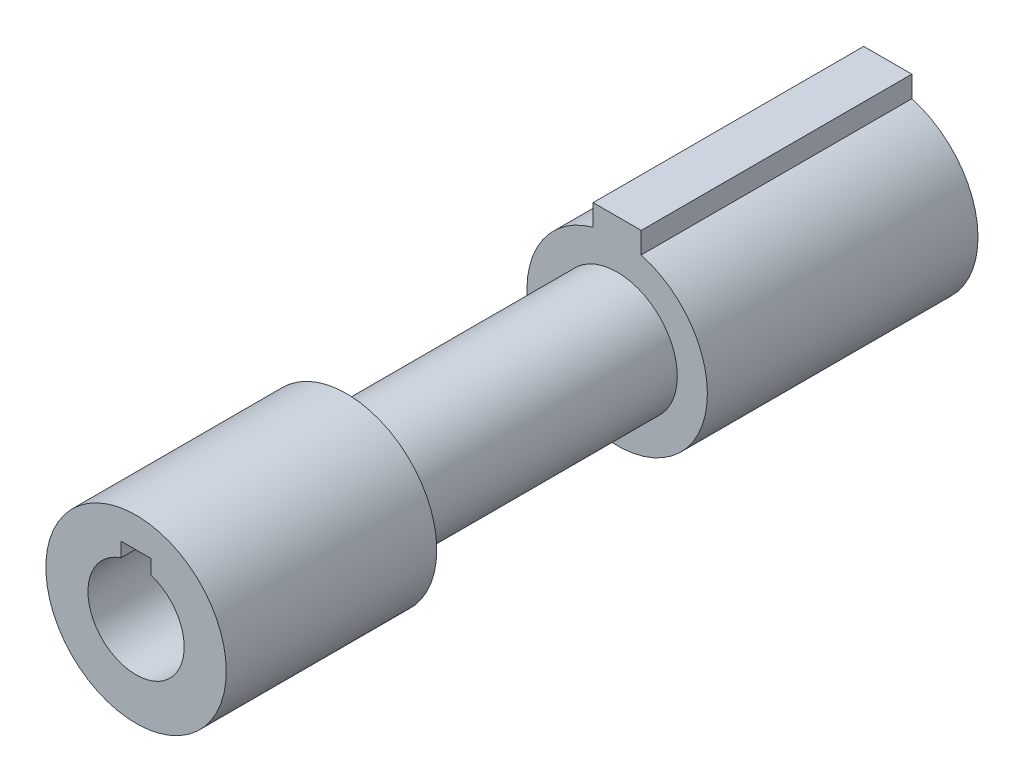
ISO-10303-21;
HEADER;
FILE_DESCRIPTION(('STEP AP214'),'2;1');
FILE_NAME('part.step','',(''),(''),'','','');
FILE_SCHEMA(('AUTOMOTIVE_DESIGN { 1 0 10303 214 1 1 1 1 }'));
ENDSEC;
DATA;
#1=APPLICATION_CONTEXT('core data for automotive mechanical design processes');
#2=APPLICATION_PROTOCOL_DEFINITION('international standard','automotive_design',2000,#1);
#3=PRODUCT_CONTEXT('',#1,'mechanical');
#4=PRODUCT('Part','Part','',(#3));
#5=PRODUCT_RELATED_PRODUCT_CATEGORY('part','',(#4));
#6=PRODUCT_DEFINITION_FORMATION('','',#4);
#7=PRODUCT_DEFINITION_CONTEXT('part definition',#1,'design');
#8=PRODUCT_DEFINITION('design','',#6,#7);
#9=PRODUCT_DEFINITION_SHAPE('','',#8);
#10=(LENGTH_UNIT() NAMED_UNIT(*) SI_UNIT(.MILLI.,.METRE.));
#11=(NAMED_UNIT(*) PLANE_ANGLE_UNIT() SI_UNIT($,.RADIAN.));
#12=(NAMED_UNIT(*) SI_UNIT($,.STERADIAN.) SOLID_ANGLE_UNIT());
#13=UNCERTAINTY_MEASURE_WITH_UNIT(LENGTH_MEASURE(1.E-05),#10,'distance_accuracy_value','');
#14=(GEOMETRIC_REPRESENTATION_CONTEXT(3) GLOBAL_UNCERTAINTY_ASSIGNED_CONTEXT((#13)) GLOBAL_UNIT_ASSIGNED_CONTEXT((#10,
#11,#12)) REPRESENTATION_CONTEXT('',''));
#15=CARTESIAN_POINT('',(0.,0.,0.));
#16=DIRECTION('',(0.,0.,1.));
#17=DIRECTION('',(1.,0.,0.));
#18=AXIS2_PLACEMENT_3D('',#15,#16,#17);
#19=CARTESIAN_POINT('',(0.,0.,-50.));
#20=DIRECTION('',(0.,0.,1.));
#21=DIRECTION('',(1.,0.,0.));
#22=AXIS2_PLACEMENT_3D('',#19,#20,#21);
#23=CYLINDRICAL_SURFACE('',#22,10.);
#24=CARTESIAN_POINT('',(0.,0.,0.));
#25=DIRECTION('',(0.,0.,1.));
#26=DIRECTION('',(1.,0.,0.));
#27=AXIS2_PLACEMENT_3D('',#24,#25,#26);
#28=CIRCLE('',#27,10.);
#29=CARTESIAN_POINT('',(10.,0.,0.));
#30=VERTEX_POINT('',#29);
#31=EDGE_CURVE('E168',#30,#30,#28,.T.);
#32=ORIENTED_EDGE('',*,*,#31,.F.);
#33=EDGE_LOOP('',(#32));
#34=FACE_BOUND('',#33,.T.);
#35=CARTESIAN_POINT('',(0.,0.,-45.));
#36=DIRECTION('',(0.,0.,-1.));
#37=DIRECTION('',(-1.,0.,0.));
#38=AXIS2_PLACEMENT_3D('',#35,#36,#37);
#39=CIRCLE('',#38,10.);
#40=CARTESIAN_POINT('',(-10.,0.,-45.));
#41=VERTEX_POINT('',#40);
#42=EDGE_CURVE('E46',#41,#41,#39,.F.);
#43=ORIENTED_EDGE('',*,*,#42,.T.);
#44=EDGE_LOOP('',(#43));
#45=FACE_BOUND('',#44,.T.);
#46=ADVANCED_FACE('F42',(#34,#45),#23,.T.);
#47=CARTESIAN_POINT('',(0.,0.,35.));
#48=DIRECTION('',(0.,0.,-1.));
#49=DIRECTION('',(-1.,0.,0.));
#50=AXIS2_PLACEMENT_3D('',#47,#48,#49);
#51=CYLINDRICAL_SURFACE('',#50,8.);
#52=CARTESIAN_POINT('',(0.,0.,0.));
#53=DIRECTION('',(0.,0.,1.));
#54=DIRECTION('',(1.,0.,0.));
#55=AXIS2_PLACEMENT_3D('',#52,#53,#54);
#56=CIRCLE('',#55,8.);
#57=CARTESIAN_POINT('',(8.,0.,0.));
#58=VERTEX_POINT('',#57);
#59=EDGE_CURVE('E186',#58,#58,#56,.T.);
#60=ORIENTED_EDGE('',*,*,#59,.F.);
#61=EDGE_LOOP('',(#60));
#62=FACE_BOUND('',#61,.T.);
#63=CARTESIAN_POINT('',(0.,0.,1.));
#64=DIRECTION('',(0.,0.,1.));
#65=DIRECTION('',(1.,0.,0.));
#66=AXIS2_PLACEMENT_3D('',#63,#64,#65);
#67=CIRCLE('',#66,8.);
#68=CARTESIAN_POINT('',(2.5,7.59934207678533,1.));
#69=VERTEX_POINT('',#68);
#70=CARTESIAN_POINT('',(-2.5,7.59934207678533,1.));
#71=VERTEX_POINT('',#70);
#72=EDGE_CURVE('E172',#69,#71,#67,.T.);
#73=ORIENTED_EDGE('',*,*,#72,.T.);
#74=DIRECTION('',(0.,0.,-1.));
#75=VECTOR('',#74,1.);
#76=CARTESIAN_POINT('',(-2.5,7.59934207678533,35.));
#77=LINE('',#76,#75);
#78=CARTESIAN_POINT('',(-2.5,7.59934207678533,35.));
#79=VERTEX_POINT('',#78);
#80=EDGE_CURVE('E11',#79,#71,#77,.T.);
#81=ORIENTED_EDGE('',*,*,#80,.F.);
#82=CARTESIAN_POINT('',(0.,0.,35.));
#83=DIRECTION('',(0.,0.,1.));
#84=DIRECTION('',(1.,0.,0.));
#85=AXIS2_PLACEMENT_3D('',#82,#83,#84);
#86=CIRCLE('',#85,8.);
#87=CARTESIAN_POINT('',(2.5,7.59934207678533,35.));
#88=VERTEX_POINT('',#87);
#89=EDGE_CURVE('E187',#79,#88,#86,.T.);
#90=ORIENTED_EDGE('',*,*,#89,.T.);
#91=DIRECTION('',(0.,0.,-1.));
#92=VECTOR('',#91,1.);
#93=CARTESIAN_POINT('',(2.5,7.59934207678533,35.));
#94=LINE('',#93,#92);
#95=EDGE_CURVE('E205',#88,#69,#94,.T.);
#96=ORIENTED_EDGE('',*,*,#95,.T.);
#97=EDGE_LOOP('',(#73,#81,#90,#96));
#98=FACE_BOUND('',#97,.T.);
#99=ADVANCED_FACE('F44',(#62,#98),#51,.F.);
#100=CARTESIAN_POINT('',(-2.5,0.,35.));
#101=DIRECTION('',(1.,0.,0.));
#102=DIRECTION('',(0.,1.,0.));
#103=AXIS2_PLACEMENT_3D('',#100,#101,#102);
#104=PLANE('',#103);
#105=DIRECTION('',(0.,-1.,0.));
#106=VECTOR('',#105,1.);
#107=CARTESIAN_POINT('',(-2.5,0.,1.));
#108=LINE('',#107,#106);
#109=CARTESIAN_POINT('',(-2.5,10.,1.));
#110=VERTEX_POINT('',#109);
#111=EDGE_CURVE('E183',#110,#71,#108,.T.);
#112=ORIENTED_EDGE('',*,*,#111,.F.);
#113=DIRECTION('',(0.,0.,-1.));
#114=VECTOR('',#113,1.);
#115=CARTESIAN_POINT('',(-2.5,10.,35.));
#116=LINE('',#115,#114);
#117=CARTESIAN_POINT('',(-2.5,10.,35.));
#118=VERTEX_POINT('',#117);
#119=EDGE_CURVE('E52',#118,#110,#116,.T.);
#120=ORIENTED_EDGE('',*,*,#119,.F.);
#121=DIRECTION('',(0.,-1.,0.));
#122=VECTOR('',#121,1.);
#123=CARTESIAN_POINT('',(-2.5,0.,35.));
#124=LINE('',#123,#122);
#125=EDGE_CURVE('E191',#118,#79,#124,.T.);
#126=ORIENTED_EDGE('',*,*,#125,.T.);
#127=ORIENTED_EDGE('',*,*,#80,.T.);
#128=EDGE_LOOP('',(#112,#120,#126,#127));
#129=FACE_BOUND('',#128,.T.);
#130=ADVANCED_FACE('F223',(#129),#104,.T.);
#131=CARTESIAN_POINT('',(0.,10.,35.));
#132=DIRECTION('',(0.,-1.,0.));
#133=DIRECTION('',(0.,0.,-1.));
#134=AXIS2_PLACEMENT_3D('',#131,#132,#133);
#135=PLANE('',#134);
#136=DIRECTION('',(-1.,0.,0.));
#137=VECTOR('',#136,1.);
#138=CARTESIAN_POINT('',(0.,10.,1.));
#139=LINE('',#138,#137);
#140=CARTESIAN_POINT('',(2.5,10.,1.));
#141=VERTEX_POINT('',#140);
#142=EDGE_CURVE('E180',#141,#110,#139,.T.);
#143=ORIENTED_EDGE('',*,*,#142,.F.);
#144=DIRECTION('',(0.,0.,-1.));
#145=VECTOR('',#144,1.);
#146=CARTESIAN_POINT('',(2.5,10.,35.));
#147=LINE('',#146,#145);
#148=CARTESIAN_POINT('',(2.5,10.,35.));
#149=VERTEX_POINT('',#148);
#150=EDGE_CURVE('E67',#149,#141,#147,.T.);
#151=ORIENTED_EDGE('',*,*,#150,.F.);
#152=DIRECTION('',(-1.,0.,0.));
#153=VECTOR('',#152,1.);
#154=CARTESIAN_POINT('',(0.,10.,35.));
#155=LINE('',#154,#153);
#156=EDGE_CURVE('E196',#149,#118,#155,.T.);
#157=ORIENTED_EDGE('',*,*,#156,.T.);
#158=ORIENTED_EDGE('',*,*,#119,.T.);
#159=EDGE_LOOP('',(#143,#151,#157,#158));
#160=FACE_BOUND('',#159,.T.);
#161=ADVANCED_FACE('F219',(#160),#135,.T.);
#162=CARTESIAN_POINT('',(2.5,0.,35.));
#163=DIRECTION('',(1.,0.,0.));
#164=DIRECTION('',(0.,1.,0.));
#165=AXIS2_PLACEMENT_3D('',#162,#163,#164);
#166=PLANE('',#165);
#167=ORIENTED_EDGE('',*,*,#150,.T.);
#168=DIRECTION('',(0.,-1.,0.));
#169=VECTOR('',#168,1.);
#170=CARTESIAN_POINT('',(2.5,0.,1.));
#171=LINE('',#170,#169);
#172=EDGE_CURVE('E176',#141,#69,#171,.T.);
#173=ORIENTED_EDGE('',*,*,#172,.T.);
#174=ORIENTED_EDGE('',*,*,#95,.F.);
#175=DIRECTION('',(0.,-1.,0.));
#176=VECTOR('',#175,1.);
#177=CARTESIAN_POINT('',(2.5,0.,35.));
#178=LINE('',#177,#176);
#179=EDGE_CURVE('E59',#149,#88,#178,.T.);
#180=ORIENTED_EDGE('',*,*,#179,.F.);
#181=EDGE_LOOP('',(#167,#173,#174,#180));
#182=FACE_BOUND('',#181,.T.);
#183=ADVANCED_FACE('F230',(#182),#166,.F.);
#184=CARTESIAN_POINT('',(0.,0.,35.));
#185=DIRECTION('',(0.,0.,-1.));
#186=DIRECTION('',(-1.,0.,0.));
#187=AXIS2_PLACEMENT_3D('',#184,#185,#186);
#188=CYLINDRICAL_SURFACE('',#187,15.);
#189=CARTESIAN_POINT('',(0.,0.,35.));
#190=DIRECTION('',(0.,0.,1.));
#191=DIRECTION('',(1.,0.,0.));
#192=AXIS2_PLACEMENT_3D('',#189,#190,#191);
#193=CIRCLE('',#192,15.);
#194=CARTESIAN_POINT('',(15.,0.,35.));
#195=VERTEX_POINT('',#194);
#196=EDGE_CURVE('E201',#195,#195,#193,.T.);
#197=ORIENTED_EDGE('',*,*,#196,.F.);
#198=EDGE_LOOP('',(#197));
#199=FACE_BOUND('',#198,.T.);
#200=CARTESIAN_POINT('',(0.,0.,0.));
#201=DIRECTION('',(0.,0.,1.));
#202=DIRECTION('',(1.,0.,0.));
#203=AXIS2_PLACEMENT_3D('',#200,#201,#202);
#204=CIRCLE('',#203,15.);
#205=CARTESIAN_POINT('',(15.,0.,0.));
#206=VERTEX_POINT('',#205);
#207=EDGE_CURVE('E192',#206,#206,#204,.T.);
#208=ORIENTED_EDGE('',*,*,#207,.T.);
#209=EDGE_LOOP('',(#208));
#210=FACE_BOUND('',#209,.T.);
#211=ADVANCED_FACE('F232',(#199,#210),#188,.T.);
#212=CARTESIAN_POINT('',(0.,0.,35.));
#213=DIRECTION('',(0.,0.,1.));
#214=DIRECTION('',(1.,0.,0.));
#215=AXIS2_PLACEMENT_3D('',#212,#213,#214);
#216=PLANE('',#215);
#217=ORIENTED_EDGE('',*,*,#89,.F.);
#218=ORIENTED_EDGE('',*,*,#125,.F.);
#219=ORIENTED_EDGE('',*,*,#156,.F.);
#220=ORIENTED_EDGE('',*,*,#179,.T.);
#221=EDGE_LOOP('',(#217,#218,#219,#220));
#222=FACE_BOUND('',#221,.T.);
#223=ORIENTED_EDGE('',*,*,#196,.T.);
#224=EDGE_LOOP('',(#223));
#225=FACE_BOUND('',#224,.T.);
#226=ADVANCED_FACE('F224',(#222,#225),#216,.T.);
#227=CARTESIAN_POINT('',(0.,0.,0.));
#228=DIRECTION('',(0.,0.,1.));
#229=DIRECTION('',(1.,0.,0.));
#230=AXIS2_PLACEMENT_3D('',#227,#228,#229);
#231=PLANE('',#230);
#232=ORIENTED_EDGE('',*,*,#31,.T.);
#233=EDGE_LOOP('',(#232));
#234=FACE_BOUND('',#233,.T.);
#235=ORIENTED_EDGE('',*,*,#207,.F.);
#236=EDGE_LOOP('',(#235));
#237=FACE_BOUND('',#236,.T.);
#238=ADVANCED_FACE('F256',(#234,#237),#231,.F.);
#239=CARTESIAN_POINT('',(0.,0.,1.));
#240=DIRECTION('',(0.,0.,1.));
#241=DIRECTION('',(1.,0.,0.));
#242=AXIS2_PLACEMENT_3D('',#239,#240,#241);
#243=PLANE('',#242);
#244=ORIENTED_EDGE('',*,*,#72,.F.);
#245=ORIENTED_EDGE('',*,*,#172,.F.);
#246=ORIENTED_EDGE('',*,*,#142,.T.);
#247=ORIENTED_EDGE('',*,*,#111,.T.);
#248=EDGE_LOOP('',(#244,#245,#246,#247));
#249=FACE_BOUND('',#248,.T.);
#250=ADVANCED_FACE('F228',(#249),#243,.T.);
#251=CARTESIAN_POINT('',(0.,0.,0.));
#252=DIRECTION('',(0.,0.,1.));
#253=DIRECTION('',(1.,0.,0.));
#254=AXIS2_PLACEMENT_3D('',#251,#252,#253);
#255=PLANE('',#254);
#256=ORIENTED_EDGE('',*,*,#59,.T.);
#257=EDGE_LOOP('',(#256));
#258=FACE_BOUND('',#257,.T.);
#259=ADVANCED_FACE('F252',(#258),#255,.T.);
#260=CARTESIAN_POINT('',(0.,0.,-45.));
#261=DIRECTION('',(0.,0.,-1.));
#262=DIRECTION('',(-1.,0.,0.));
#263=AXIS2_PLACEMENT_3D('',#260,#261,#262);
#264=CYLINDRICAL_SURFACE('',#263,15.);
#265=DIRECTION('',(0.,0.,-1.));
#266=VECTOR('',#265,1.);
#267=CARTESIAN_POINT('',(-4.,14.456832294801,-45.));
#268=LINE('',#267,#266);
#269=CARTESIAN_POINT('',(-4.,14.456832294801,-45.));
#270=VERTEX_POINT('',#269);
#271=CARTESIAN_POINT('',(-4.,14.456832294801,-90.));
#272=VERTEX_POINT('',#271);
#273=EDGE_CURVE('E113',#270,#272,#268,.T.);
#274=ORIENTED_EDGE('',*,*,#273,.T.);
#275=CARTESIAN_POINT('',(0.,0.,-90.));
#276=DIRECTION('',(0.,0.,-1.));
#277=DIRECTION('',(-1.,0.,0.));
#278=AXIS2_PLACEMENT_3D('',#275,#276,#277);
#279=CIRCLE('',#278,15.);
#280=CARTESIAN_POINT('',(4.,14.456832294801,-90.));
#281=VERTEX_POINT('',#280);
#282=EDGE_CURVE('E116',#281,#272,#279,.T.);
#283=ORIENTED_EDGE('',*,*,#282,.F.);
#284=DIRECTION('',(0.,0.,-1.));
#285=VECTOR('',#284,1.);
#286=CARTESIAN_POINT('',(4.,14.456832294801,-45.));
#287=LINE('',#286,#285);
#288=CARTESIAN_POINT('',(4.,14.456832294801,-45.));
#289=VERTEX_POINT('',#288);
#290=EDGE_CURVE('E160',#289,#281,#287,.T.);
#291=ORIENTED_EDGE('',*,*,#290,.F.);
#292=CARTESIAN_POINT('',(0.,0.,-45.));
#293=DIRECTION('',(0.,0.,-1.));
#294=DIRECTION('',(-1.,0.,0.));
#295=AXIS2_PLACEMENT_3D('',#292,#293,#294);
#296=CIRCLE('',#295,15.);
#297=EDGE_CURVE('E118',#289,#270,#296,.T.);
#298=ORIENTED_EDGE('',*,*,#297,.T.);
#299=EDGE_LOOP('',(#274,#283,#291,#298));
#300=FACE_BOUND('',#299,.T.);
#301=ADVANCED_FACE('F115',(#300),#264,.T.);
#302=CARTESIAN_POINT('',(4.,0.,-45.));
#303=DIRECTION('',(1.,0.,0.));
#304=DIRECTION('',(0.,1.,0.));
#305=AXIS2_PLACEMENT_3D('',#302,#303,#304);
#306=PLANE('',#305);
#307=ORIENTED_EDGE('',*,*,#290,.T.);
#308=DIRECTION('',(0.,-1.,0.));
#309=VECTOR('',#308,1.);
#310=CARTESIAN_POINT('',(4.,0.,-90.));
#311=LINE('',#310,#309);
#312=CARTESIAN_POINT('',(4.,18.,-90.));
#313=VERTEX_POINT('',#312);
#314=EDGE_CURVE('E134',#313,#281,#311,.T.);
#315=ORIENTED_EDGE('',*,*,#314,.F.);
#316=DIRECTION('',(0.,0.,-1.));
#317=VECTOR('',#316,1.);
#318=CARTESIAN_POINT('',(4.,18.,-45.));
#319=LINE('',#318,#317);
#320=CARTESIAN_POINT('',(4.,18.,-45.));
#321=VERTEX_POINT('',#320);
#322=EDGE_CURVE('E163',#321,#313,#319,.T.);
#323=ORIENTED_EDGE('',*,*,#322,.F.);
#324=DIRECTION('',(0.,-1.,0.));
#325=VECTOR('',#324,1.);
#326=CARTESIAN_POINT('',(4.,0.,-45.));
#327=LINE('',#326,#325);
#328=EDGE_CURVE('E124',#321,#289,#327,.T.);
#329=ORIENTED_EDGE('',*,*,#328,.T.);
#330=EDGE_LOOP('',(#307,#315,#323,#329));
#331=FACE_BOUND('',#330,.T.);
#332=ADVANCED_FACE('F284',(#331),#306,.T.);
#333=CARTESIAN_POINT('',(0.,18.,-45.));
#334=DIRECTION('',(0.,-1.,0.));
#335=DIRECTION('',(0.,0.,-1.));
#336=AXIS2_PLACEMENT_3D('',#333,#334,#335);
#337=PLANE('',#336);
#338=ORIENTED_EDGE('',*,*,#322,.T.);
#339=DIRECTION('',(-1.,0.,0.));
#340=VECTOR('',#339,1.);
#341=CARTESIAN_POINT('',(0.,18.,-90.));
#342=LINE('',#341,#340);
#343=CARTESIAN_POINT('',(-4.,18.,-90.));
#344=VERTEX_POINT('',#343);
#345=EDGE_CURVE('E141',#313,#344,#342,.T.);
#346=ORIENTED_EDGE('',*,*,#345,.T.);
#347=DIRECTION('',(0.,0.,-1.));
#348=VECTOR('',#347,1.);
#349=CARTESIAN_POINT('',(-4.,18.,-45.));
#350=LINE('',#349,#348);
#351=CARTESIAN_POINT('',(-4.,18.,-45.));
#352=VERTEX_POINT('',#351);
#353=EDGE_CURVE('E123',#352,#344,#350,.T.);
#354=ORIENTED_EDGE('',*,*,#353,.F.);
#355=DIRECTION('',(-1.,0.,0.));
#356=VECTOR('',#355,1.);
#357=CARTESIAN_POINT('',(0.,18.,-45.));
#358=LINE('',#357,#356);
#359=EDGE_CURVE('E154',#321,#352,#358,.T.);
#360=ORIENTED_EDGE('',*,*,#359,.F.);
#361=EDGE_LOOP('',(#338,#346,#354,#360));
#362=FACE_BOUND('',#361,.T.);
#363=ADVANCED_FACE('F290',(#362),#337,.F.);
#364=CARTESIAN_POINT('',(-4.,0.,-45.));
#365=DIRECTION('',(1.,0.,0.));
#366=DIRECTION('',(0.,1.,0.));
#367=AXIS2_PLACEMENT_3D('',#364,#365,#366);
#368=PLANE('',#367);
#369=ORIENTED_EDGE('',*,*,#353,.T.);
#370=DIRECTION('',(0.,-1.,0.));
#371=VECTOR('',#370,1.);
#372=CARTESIAN_POINT('',(-4.,0.,-90.));
#373=LINE('',#372,#371);
#374=EDGE_CURVE('E131',#344,#272,#373,.T.);
#375=ORIENTED_EDGE('',*,*,#374,.T.);
#376=ORIENTED_EDGE('',*,*,#273,.F.);
#377=DIRECTION('',(0.,-1.,0.));
#378=VECTOR('',#377,1.);
#379=CARTESIAN_POINT('',(-4.,0.,-45.));
#380=LINE('',#379,#378);
#381=EDGE_CURVE('E151',#352,#270,#380,.T.);
#382=ORIENTED_EDGE('',*,*,#381,.F.);
#383=EDGE_LOOP('',(#369,#375,#376,#382));
#384=FACE_BOUND('',#383,.T.);
#385=ADVANCED_FACE('F138',(#384),#368,.F.);
#386=CARTESIAN_POINT('',(0.,0.,-45.));
#387=DIRECTION('',(0.,0.,-1.));
#388=DIRECTION('',(-1.,0.,0.));
#389=AXIS2_PLACEMENT_3D('',#386,#387,#388);
#390=PLANE('',#389);
#391=ORIENTED_EDGE('',*,*,#42,.F.);
#392=EDGE_LOOP('',(#391));
#393=FACE_BOUND('',#392,.T.);
#394=ORIENTED_EDGE('',*,*,#297,.F.);
#395=ORIENTED_EDGE('',*,*,#328,.F.);
#396=ORIENTED_EDGE('',*,*,#359,.T.);
#397=ORIENTED_EDGE('',*,*,#381,.T.);
#398=EDGE_LOOP('',(#394,#395,#396,#397));
#399=FACE_BOUND('',#398,.T.);
#400=ADVANCED_FACE('F305',(#393,#399),#390,.F.);
#401=CARTESIAN_POINT('',(0.,0.,-90.));
#402=DIRECTION('',(0.,0.,-1.));
#403=DIRECTION('',(-1.,0.,0.));
#404=AXIS2_PLACEMENT_3D('',#401,#402,#403);
#405=PLANE('',#404);
#406=ORIENTED_EDGE('',*,*,#282,.T.);
#407=ORIENTED_EDGE('',*,*,#374,.F.);
#408=ORIENTED_EDGE('',*,*,#345,.F.);
#409=ORIENTED_EDGE('',*,*,#314,.T.);
#410=EDGE_LOOP('',(#406,#407,#408,#409));
#411=FACE_BOUND('',#410,.T.);
#412=ADVANCED_FACE('F129',(#411),#405,.T.);
#413=CLOSED_SHELL('',(#46,#99,#130,#161,#183,#211,#226,#238,#250,#259,#301,#332,#363,#385,#400,#412));
#414=CARTESIAN_POINT('',(0.,0.,-80.));
#415=DIRECTION('',(0.,0.,1.));
#416=DIRECTION('',(1.,0.,0.));
#417=AXIS2_PLACEMENT_3D('',#414,#415,#416);
#418=CYLINDRICAL_SURFACE('',#417,10.);
#419=CARTESIAN_POINT('',(0.,0.,-80.));
#420=DIRECTION('',(0.,0.,-1.));
#421=DIRECTION('',(-1.,0.,0.));
#422=AXIS2_PLACEMENT_3D('',#419,#420,#421);
#423=CIRCLE('',#422,10.);
#424=CARTESIAN_POINT('',(-10.,0.,-80.));
#425=VERTEX_POINT('',#424);
#426=EDGE_CURVE('E136',#425,#425,#423,.T.);
#427=ORIENTED_EDGE('',*,*,#426,.T.);
#428=EDGE_LOOP('',(#427));
#429=FACE_BOUND('',#428,.T.);
#430=CARTESIAN_POINT('',(0.,0.,-50.));
#431=DIRECTION('',(0.,0.,-1.));
#432=DIRECTION('',(-1.,0.,0.));
#433=AXIS2_PLACEMENT_3D('',#430,#431,#432);
#434=CIRCLE('',#433,10.);
#435=CARTESIAN_POINT('',(-10.,0.,-50.));
#436=VERTEX_POINT('',#435);
#437=EDGE_CURVE('E434',#436,#436,#434,.T.);
#438=ORIENTED_EDGE('',*,*,#437,.F.);
#439=EDGE_LOOP('',(#438));
#440=FACE_BOUND('',#439,.T.);
#441=ADVANCED_FACE('F323',(#429,#440),#418,.F.);
#442=CARTESIAN_POINT('',(0.,0.,-80.));
#443=DIRECTION('',(0.,0.,-1.));
#444=DIRECTION('',(-1.,0.,0.));
#445=AXIS2_PLACEMENT_3D('',#442,#443,#444);
#446=PLANE('',#445);
#447=ORIENTED_EDGE('',*,*,#426,.F.);
#448=EDGE_LOOP('',(#447));
#449=FACE_BOUND('',#448,.T.);
#450=ADVANCED_FACE('F326',(#449),#446,.F.);
#451=CARTESIAN_POINT('',(0.,0.,-50.));
#452=DIRECTION('',(0.,0.,-1.));
#453=DIRECTION('',(-1.,0.,0.));
#454=AXIS2_PLACEMENT_3D('',#451,#452,#453);
#455=PLANE('',#454);
#456=ORIENTED_EDGE('',*,*,#437,.T.);
#457=EDGE_LOOP('',(#456));
#458=FACE_BOUND('',#457,.T.);
#459=ADVANCED_FACE('F335',(#458),#455,.T.);
#460=CLOSED_SHELL('',(#441,#450,#459));
#461=ORIENTED_CLOSED_SHELL('',*,#460,.T.);
#462=BREP_WITH_VOIDS('B2',#413,(#461));
#463=ADVANCED_BREP_SHAPE_REPRESENTATION('',(#18,#462),#14);
#464=SHAPE_DEFINITION_REPRESENTATION(#9,#463);
ENDSEC;
END-ISO-10303-21;
